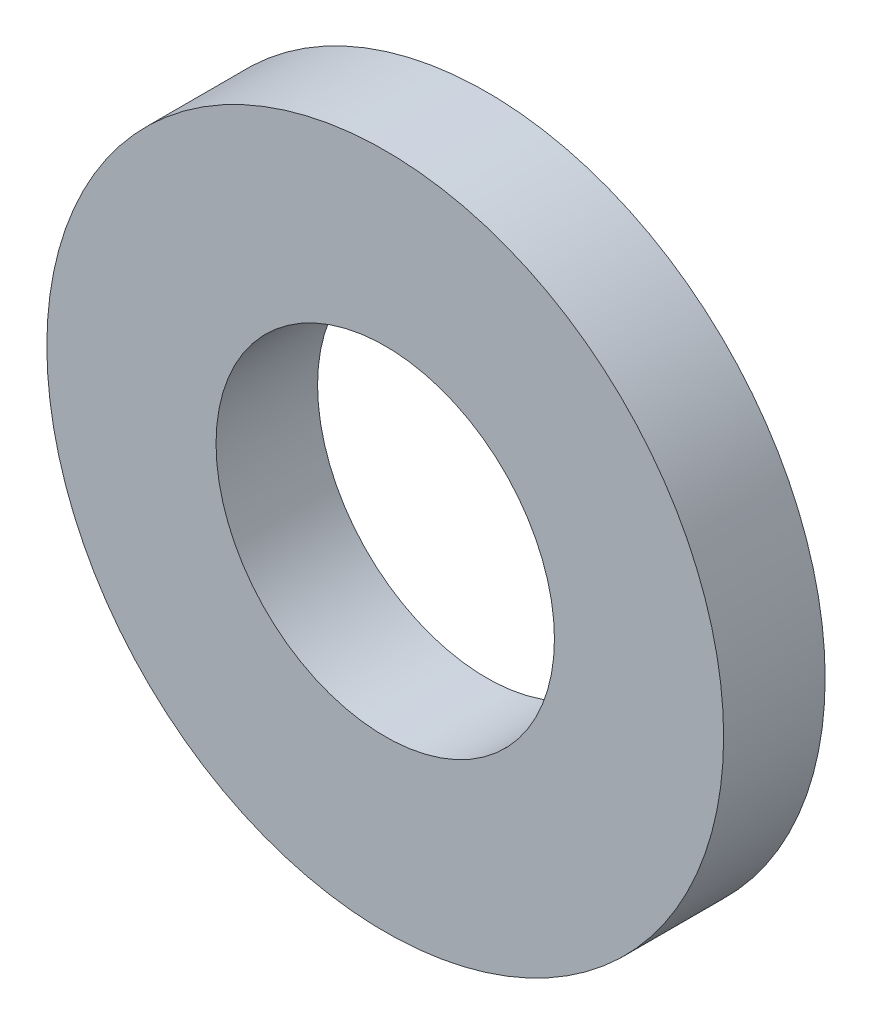
ISO-10303-21;
HEADER;
FILE_DESCRIPTION(('STEP AP214'),'2;1');
FILE_NAME('part.step','',(''),(''),'','','');
FILE_SCHEMA(('AUTOMOTIVE_DESIGN { 1 0 10303 214 1 1 1 1 }'));
ENDSEC;
DATA;
#1=APPLICATION_CONTEXT('core data for automotive mechanical design processes');
#2=APPLICATION_PROTOCOL_DEFINITION('international standard','automotive_design',2000,#1);
#3=PRODUCT_CONTEXT('',#1,'mechanical');
#4=PRODUCT('Part','Part','',(#3));
#5=PRODUCT_RELATED_PRODUCT_CATEGORY('part','',(#4));
#6=PRODUCT_DEFINITION_FORMATION('','',#4);
#7=PRODUCT_DEFINITION_CONTEXT('part definition',#1,'design');
#8=PRODUCT_DEFINITION('design','',#6,#7);
#9=PRODUCT_DEFINITION_SHAPE('','',#8);
#10=(LENGTH_UNIT() NAMED_UNIT(*) SI_UNIT(.MILLI.,.METRE.));
#11=(NAMED_UNIT(*) PLANE_ANGLE_UNIT() SI_UNIT($,.RADIAN.));
#12=(NAMED_UNIT(*) SI_UNIT($,.STERADIAN.) SOLID_ANGLE_UNIT());
#13=UNCERTAINTY_MEASURE_WITH_UNIT(LENGTH_MEASURE(1.E-05),#10,'distance_accuracy_value','');
#14=(GEOMETRIC_REPRESENTATION_CONTEXT(3) GLOBAL_UNCERTAINTY_ASSIGNED_CONTEXT((#13)) GLOBAL_UNIT_ASSIGNED_CONTEXT((#10,
#11,#12)) REPRESENTATION_CONTEXT('',''));
#15=CARTESIAN_POINT('',(0.,0.,0.));
#16=DIRECTION('',(0.,0.,1.));
#17=DIRECTION('',(1.,0.,0.));
#18=AXIS2_PLACEMENT_3D('',#15,#16,#17);
#19=CARTESIAN_POINT('',(0.,0.,0.9));
#20=DIRECTION('',(0.,0.,1.));
#21=DIRECTION('',(1.,0.,0.));
#22=AXIS2_PLACEMENT_3D('',#19,#20,#21);
#23=PLANE('',#22);
#24=CARTESIAN_POINT('',(0.,0.,0.9));
#25=DIRECTION('',(0.,0.,1.));
#26=DIRECTION('',(1.,0.,0.));
#27=AXIS2_PLACEMENT_3D('',#24,#25,#26);
#28=CIRCLE('',#27,3.);
#29=CARTESIAN_POINT('',(3.,0.,0.9));
#30=VERTEX_POINT('',#29);
#31=EDGE_CURVE('E10',#30,#30,#28,.T.);
#32=ORIENTED_EDGE('',*,*,#31,.T.);
#33=EDGE_LOOP('',(#32));
#34=FACE_BOUND('',#33,.T.);
#35=CARTESIAN_POINT('',(0.,0.,0.9));
#36=DIRECTION('',(0.,0.,1.));
#37=DIRECTION('',(1.,0.,0.));
#38=AXIS2_PLACEMENT_3D('',#35,#36,#37);
#39=CIRCLE('',#38,1.5);
#40=CARTESIAN_POINT('',(1.5,0.,0.9));
#41=VERTEX_POINT('',#40);
#42=EDGE_CURVE('E47',#41,#41,#39,.T.);
#43=ORIENTED_EDGE('',*,*,#42,.F.);
#44=EDGE_LOOP('',(#43));
#45=FACE_BOUND('',#44,.T.);
#46=ADVANCED_FACE('F36',(#34,#45),#23,.T.);
#47=CARTESIAN_POINT('',(0.,0.,0.));
#48=DIRECTION('',(0.,0.,1.));
#49=DIRECTION('',(1.,0.,0.));
#50=AXIS2_PLACEMENT_3D('',#47,#48,#49);
#51=PLANE('',#50);
#52=CARTESIAN_POINT('',(0.,0.,0.));
#53=DIRECTION('',(0.,0.,1.));
#54=DIRECTION('',(1.,0.,0.));
#55=AXIS2_PLACEMENT_3D('',#52,#53,#54);
#56=CIRCLE('',#55,3.);
#57=CARTESIAN_POINT('',(3.,0.,0.));
#58=VERTEX_POINT('',#57);
#59=EDGE_CURVE('E40',#58,#58,#56,.T.);
#60=ORIENTED_EDGE('',*,*,#59,.F.);
#61=EDGE_LOOP('',(#60));
#62=FACE_BOUND('',#61,.T.);
#63=CARTESIAN_POINT('',(0.,0.,0.));
#64=DIRECTION('',(0.,0.,1.));
#65=DIRECTION('',(1.,0.,0.));
#66=AXIS2_PLACEMENT_3D('',#63,#64,#65);
#67=CIRCLE('',#66,1.5);
#68=CARTESIAN_POINT('',(1.5,0.,0.));
#69=VERTEX_POINT('',#68);
#70=EDGE_CURVE('E49',#69,#69,#67,.T.);
#71=ORIENTED_EDGE('',*,*,#70,.T.);
#72=EDGE_LOOP('',(#71));
#73=FACE_BOUND('',#72,.T.);
#74=ADVANCED_FACE('F59',(#62,#73),#51,.F.);
#75=CARTESIAN_POINT('',(0.,0.,0.9));
#76=DIRECTION('',(0.,0.,-1.));
#77=DIRECTION('',(-1.,0.,0.));
#78=AXIS2_PLACEMENT_3D('',#75,#76,#77);
#79=CYLINDRICAL_SURFACE('',#78,3.);
#80=ORIENTED_EDGE('',*,*,#31,.F.);
#81=EDGE_LOOP('',(#80));
#82=FACE_BOUND('',#81,.T.);
#83=ORIENTED_EDGE('',*,*,#59,.T.);
#84=EDGE_LOOP('',(#83));
#85=FACE_BOUND('',#84,.T.);
#86=ADVANCED_FACE('F38',(#82,#85),#79,.T.);
#87=CARTESIAN_POINT('',(0.,0.,0.9));
#88=DIRECTION('',(0.,0.,-1.));
#89=DIRECTION('',(-1.,0.,0.));
#90=AXIS2_PLACEMENT_3D('',#87,#88,#89);
#91=CYLINDRICAL_SURFACE('',#90,1.5);
#92=ORIENTED_EDGE('',*,*,#42,.T.);
#93=EDGE_LOOP('',(#92));
#94=FACE_BOUND('',#93,.T.);
#95=ORIENTED_EDGE('',*,*,#70,.F.);
#96=EDGE_LOOP('',(#95));
#97=FACE_BOUND('',#96,.T.);
#98=ADVANCED_FACE('F55',(#94,#97),#91,.F.);
#99=CLOSED_SHELL('',(#46,#74,#86,#98));
#100=MANIFOLD_SOLID_BREP('B2',#99);
#101=ADVANCED_BREP_SHAPE_REPRESENTATION('',(#18,#100),#14);
#102=SHAPE_DEFINITION_REPRESENTATION(#9,#101);
ENDSEC;
END-ISO-10303-21;
